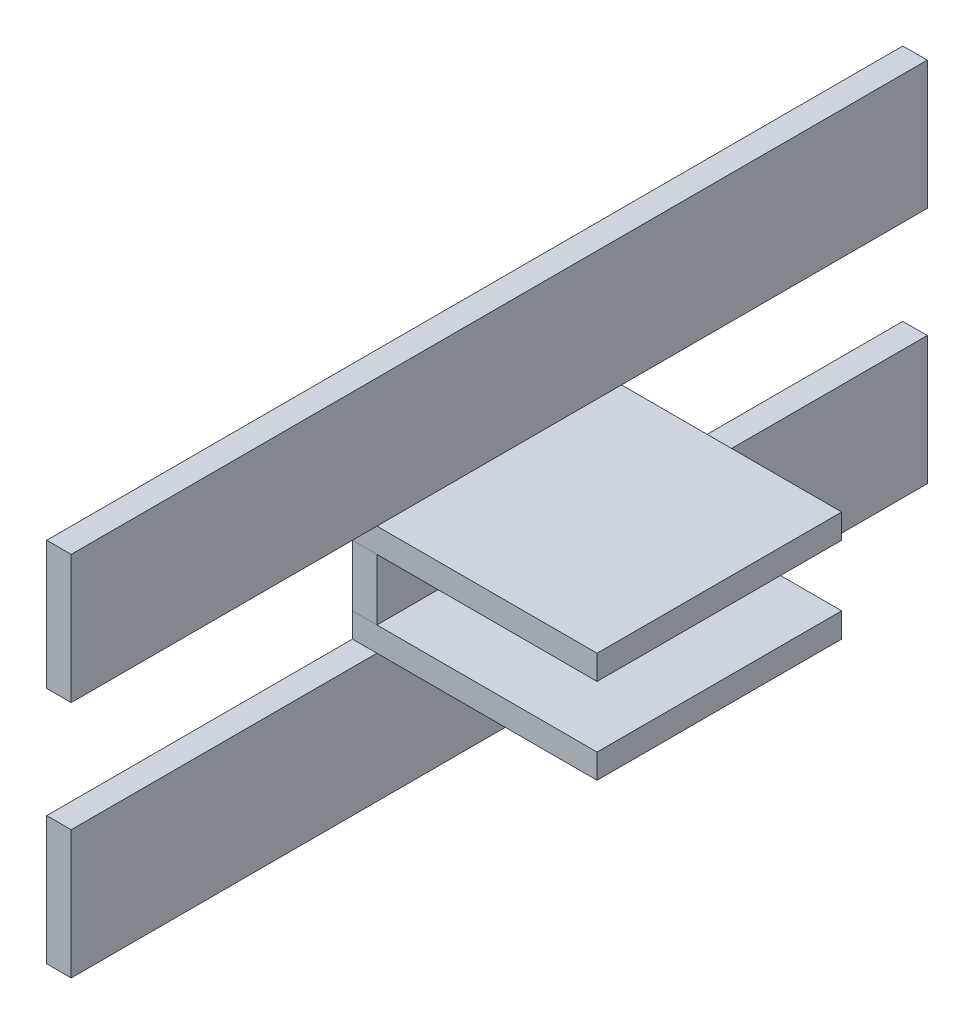
ISO-10303-21;
HEADER;
FILE_DESCRIPTION(('STEP AP214'),'2;1');
FILE_NAME('part.step','',(''),(''),'','','');
FILE_SCHEMA(('AUTOMOTIVE_DESIGN { 1 0 10303 214 1 1 1 1 }'));
ENDSEC;
DATA;
#1=APPLICATION_CONTEXT('core data for automotive mechanical design processes');
#2=APPLICATION_PROTOCOL_DEFINITION('international standard','automotive_design',2000,#1);
#3=PRODUCT_CONTEXT('',#1,'mechanical');
#4=PRODUCT('Part','Part','',(#3));
#5=PRODUCT_RELATED_PRODUCT_CATEGORY('part','',(#4));
#6=PRODUCT_DEFINITION_FORMATION('','',#4);
#7=PRODUCT_DEFINITION_CONTEXT('part definition',#1,'design');
#8=PRODUCT_DEFINITION('design','',#6,#7);
#9=PRODUCT_DEFINITION_SHAPE('','',#8);
#10=(LENGTH_UNIT() NAMED_UNIT(*) SI_UNIT(.MILLI.,.METRE.));
#11=(NAMED_UNIT(*) PLANE_ANGLE_UNIT() SI_UNIT($,.RADIAN.));
#12=(NAMED_UNIT(*) SI_UNIT($,.STERADIAN.) SOLID_ANGLE_UNIT());
#13=UNCERTAINTY_MEASURE_WITH_UNIT(LENGTH_MEASURE(1.E-05),#10,'distance_accuracy_value','');
#14=(GEOMETRIC_REPRESENTATION_CONTEXT(3) GLOBAL_UNCERTAINTY_ASSIGNED_CONTEXT((#13)) GLOBAL_UNIT_ASSIGNED_CONTEXT((#10,
#11,#12)) REPRESENTATION_CONTEXT('',''));
#15=CARTESIAN_POINT('',(0.,0.,0.));
#16=DIRECTION('',(0.,0.,1.));
#17=DIRECTION('',(1.,0.,0.));
#18=AXIS2_PLACEMENT_3D('',#15,#16,#17);
#19=CARTESIAN_POINT('',(2.,0.,-45.));
#20=DIRECTION('',(0.,0.,-1.));
#21=DIRECTION('',(-1.,0.,0.));
#22=AXIS2_PLACEMENT_3D('',#19,#20,#21);
#23=PLANE('',#22);
#24=DIRECTION('',(0.,-1.,0.));
#25=VECTOR('',#24,1.);
#26=CARTESIAN_POINT('',(0.,0.,-45.));
#27=LINE('',#26,#25);
#28=CARTESIAN_POINT('',(0.,17.5,-45.));
#29=VERTEX_POINT('',#28);
#30=CARTESIAN_POINT('',(0.,12.5,-45.));
#31=VERTEX_POINT('',#30);
#32=EDGE_CURVE('E115',#29,#31,#27,.T.);
#33=ORIENTED_EDGE('',*,*,#32,.F.);
#34=DIRECTION('',(-1.,0.,0.));
#35=VECTOR('',#34,1.);
#36=CARTESIAN_POINT('',(2.,17.5,-45.));
#37=LINE('',#36,#35);
#38=CARTESIAN_POINT('',(2.,17.5,-45.));
#39=VERTEX_POINT('',#38);
#40=EDGE_CURVE('E12',#39,#29,#37,.T.);
#41=ORIENTED_EDGE('',*,*,#40,.F.);
#42=DIRECTION('',(0.,-1.,0.));
#43=VECTOR('',#42,1.);
#44=CARTESIAN_POINT('',(2.,0.,-45.));
#45=LINE('',#44,#43);
#46=CARTESIAN_POINT('',(2.,12.5,-45.));
#47=VERTEX_POINT('',#46);
#48=EDGE_CURVE('E108',#39,#47,#45,.T.);
#49=ORIENTED_EDGE('',*,*,#48,.T.);
#50=DIRECTION('',(-1.,0.,0.));
#51=VECTOR('',#50,1.);
#52=CARTESIAN_POINT('',(2.,12.5,-45.));
#53=LINE('',#52,#51);
#54=EDGE_CURVE('E90',#47,#31,#53,.T.);
#55=ORIENTED_EDGE('',*,*,#54,.T.);
#56=EDGE_LOOP('',(#33,#41,#49,#55));
#57=FACE_BOUND('',#56,.T.);
#58=ADVANCED_FACE('F52',(#57),#23,.T.);
#59=CARTESIAN_POINT('',(2.,17.5,0.));
#60=DIRECTION('',(0.,1.,0.));
#61=DIRECTION('',(0.,0.,1.));
#62=AXIS2_PLACEMENT_3D('',#59,#60,#61);
#63=PLANE('',#62);
#64=DIRECTION('',(0.,0.,-1.));
#65=VECTOR('',#64,1.);
#66=CARTESIAN_POINT('',(0.,17.5,0.));
#67=LINE('',#66,#65);
#68=CARTESIAN_POINT('',(0.,17.5,-25.));
#69=VERTEX_POINT('',#68);
#70=EDGE_CURVE('E101',#69,#29,#67,.T.);
#71=ORIENTED_EDGE('',*,*,#70,.F.);
#72=DIRECTION('',(-1.,0.,0.));
#73=VECTOR('',#72,1.);
#74=CARTESIAN_POINT('',(2.,17.5,-25.));
#75=LINE('',#74,#73);
#76=CARTESIAN_POINT('',(2.,17.5,-25.));
#77=VERTEX_POINT('',#76);
#78=EDGE_CURVE('E60',#77,#69,#75,.T.);
#79=ORIENTED_EDGE('',*,*,#78,.F.);
#80=DIRECTION('',(0.,0.,-1.));
#81=VECTOR('',#80,1.);
#82=CARTESIAN_POINT('',(2.,17.5,0.));
#83=LINE('',#82,#81);
#84=EDGE_CURVE('E99',#77,#39,#83,.T.);
#85=ORIENTED_EDGE('',*,*,#84,.T.);
#86=ORIENTED_EDGE('',*,*,#40,.T.);
#87=EDGE_LOOP('',(#71,#79,#85,#86));
#88=FACE_BOUND('',#87,.T.);
#89=ADVANCED_FACE('F98',(#88),#63,.T.);
#90=CARTESIAN_POINT('',(2.,0.,-25.));
#91=DIRECTION('',(0.,0.,1.));
#92=DIRECTION('',(1.,0.,0.));
#93=AXIS2_PLACEMENT_3D('',#90,#91,#92);
#94=PLANE('',#93);
#95=DIRECTION('',(0.,1.,0.));
#96=VECTOR('',#95,1.);
#97=CARTESIAN_POINT('',(0.,0.,-25.));
#98=LINE('',#97,#96);
#99=CARTESIAN_POINT('',(0.,12.5,-25.));
#100=VERTEX_POINT('',#99);
#101=EDGE_CURVE('E119',#100,#69,#98,.T.);
#102=ORIENTED_EDGE('',*,*,#101,.F.);
#103=DIRECTION('',(-1.,0.,0.));
#104=VECTOR('',#103,1.);
#105=CARTESIAN_POINT('',(2.,12.5,-25.));
#106=LINE('',#105,#104);
#107=CARTESIAN_POINT('',(2.,12.5,-25.));
#108=VERTEX_POINT('',#107);
#109=EDGE_CURVE('E83',#108,#100,#106,.T.);
#110=ORIENTED_EDGE('',*,*,#109,.F.);
#111=DIRECTION('',(0.,1.,0.));
#112=VECTOR('',#111,1.);
#113=CARTESIAN_POINT('',(2.,0.,-25.));
#114=LINE('',#113,#112);
#115=EDGE_CURVE('E107',#108,#77,#114,.T.);
#116=ORIENTED_EDGE('',*,*,#115,.T.);
#117=ORIENTED_EDGE('',*,*,#78,.T.);
#118=EDGE_LOOP('',(#102,#110,#116,#117));
#119=FACE_BOUND('',#118,.T.);
#120=ADVANCED_FACE('F110',(#119),#94,.T.);
#121=CARTESIAN_POINT('',(2.,12.5,0.));
#122=DIRECTION('',(0.,1.,0.));
#123=DIRECTION('',(0.,0.,1.));
#124=AXIS2_PLACEMENT_3D('',#121,#122,#123);
#125=PLANE('',#124);
#126=DIRECTION('',(0.,0.,-1.));
#127=VECTOR('',#126,1.);
#128=CARTESIAN_POINT('',(0.,12.5,0.));
#129=LINE('',#128,#127);
#130=EDGE_CURVE('E121',#100,#31,#129,.T.);
#131=ORIENTED_EDGE('',*,*,#130,.T.);
#132=ORIENTED_EDGE('',*,*,#54,.F.);
#133=DIRECTION('',(0.,0.,-1.));
#134=VECTOR('',#133,1.);
#135=CARTESIAN_POINT('',(2.,12.5,0.));
#136=LINE('',#135,#134);
#137=EDGE_CURVE('E68',#108,#47,#136,.T.);
#138=ORIENTED_EDGE('',*,*,#137,.F.);
#139=ORIENTED_EDGE('',*,*,#109,.T.);
#140=EDGE_LOOP('',(#131,#132,#138,#139));
#141=FACE_BOUND('',#140,.T.);
#142=ADVANCED_FACE('F131',(#141),#125,.F.);
#143=CARTESIAN_POINT('',(2.,0.,0.));
#144=DIRECTION('',(1.,0.,0.));
#145=DIRECTION('',(0.,0.,-1.));
#146=AXIS2_PLACEMENT_3D('',#143,#144,#145);
#147=PLANE('',#146);
#148=ORIENTED_EDGE('',*,*,#48,.F.);
#149=ORIENTED_EDGE('',*,*,#84,.F.);
#150=ORIENTED_EDGE('',*,*,#115,.F.);
#151=ORIENTED_EDGE('',*,*,#137,.T.);
#152=EDGE_LOOP('',(#148,#149,#150,#151));
#153=FACE_BOUND('',#152,.T.);
#154=ADVANCED_FACE('F106',(#153),#147,.T.);
#155=CARTESIAN_POINT('',(0.,0.,0.));
#156=DIRECTION('',(1.,0.,0.));
#157=DIRECTION('',(0.,0.,-1.));
#158=AXIS2_PLACEMENT_3D('',#155,#156,#157);
#159=PLANE('',#158);
#160=ORIENTED_EDGE('',*,*,#32,.T.);
#161=ORIENTED_EDGE('',*,*,#130,.F.);
#162=ORIENTED_EDGE('',*,*,#101,.T.);
#163=ORIENTED_EDGE('',*,*,#70,.T.);
#164=EDGE_LOOP('',(#160,#161,#162,#163));
#165=FACE_BOUND('',#164,.T.);
#166=ADVANCED_FACE('F136',(#165),#159,.F.);
#167=CLOSED_SHELL('',(#58,#89,#120,#142,#154,#166));
#168=MANIFOLD_SOLID_BREP('B2',#167);
#169=CARTESIAN_POINT('',(2.,10.5,0.));
#170=DIRECTION('',(0.,-1.,0.));
#171=DIRECTION('',(0.,0.,-1.));
#172=AXIS2_PLACEMENT_3D('',#169,#170,#171);
#173=PLANE('',#172);
#174=DIRECTION('',(-1.,0.,0.));
#175=VECTOR('',#174,1.);
#176=CARTESIAN_POINT('',(20.,10.5,-45.));
#177=LINE('',#176,#175);
#178=CARTESIAN_POINT('',(2.,10.5,-45.));
#179=VERTEX_POINT('',#178);
#180=CARTESIAN_POINT('',(0.,10.5,-45.));
#181=VERTEX_POINT('',#180);
#182=EDGE_CURVE('E50',#179,#181,#177,.T.);
#183=ORIENTED_EDGE('',*,*,#182,.F.);
#184=DIRECTION('',(0.,0.,1.));
#185=VECTOR('',#184,1.);
#186=CARTESIAN_POINT('',(2.,10.5,0.));
#187=LINE('',#186,#185);
#188=CARTESIAN_POINT('',(2.,10.5,-70.));
#189=VERTEX_POINT('',#188);
#190=EDGE_CURVE('E326',#189,#179,#187,.T.);
#191=ORIENTED_EDGE('',*,*,#190,.F.);
#192=DIRECTION('',(-1.,0.,0.));
#193=VECTOR('',#192,1.);
#194=CARTESIAN_POINT('',(2.,10.5,-70.));
#195=LINE('',#194,#193);
#196=CARTESIAN_POINT('',(0.,10.5,-70.));
#197=VERTEX_POINT('',#196);
#198=EDGE_CURVE('E195',#189,#197,#195,.T.);
#199=ORIENTED_EDGE('',*,*,#198,.T.);
#200=DIRECTION('',(0.,0.,1.));
#201=VECTOR('',#200,1.);
#202=CARTESIAN_POINT('',(0.,10.5,0.));
#203=LINE('',#202,#201);
#204=EDGE_CURVE('E340',#197,#181,#203,.T.);
#205=ORIENTED_EDGE('',*,*,#204,.T.);
#206=EDGE_LOOP('',(#183,#191,#199,#205));
#207=FACE_BOUND('',#206,.T.);
#208=ADVANCED_FACE('F191',(#207),#173,.F.);
#209=CARTESIAN_POINT('',(2.,0.,-70.));
#210=DIRECTION('',(0.,0.,-1.));
#211=DIRECTION('',(-1.,0.,0.));
#212=AXIS2_PLACEMENT_3D('',#209,#210,#211);
#213=PLANE('',#212);
#214=DIRECTION('',(0.,-1.,0.));
#215=VECTOR('',#214,1.);
#216=CARTESIAN_POINT('',(0.,0.,-70.));
#217=LINE('',#216,#215);
#218=CARTESIAN_POINT('',(0.,0.,-70.));
#219=VERTEX_POINT('',#218);
#220=EDGE_CURVE('E285',#197,#219,#217,.T.);
#221=ORIENTED_EDGE('',*,*,#220,.F.);
#222=ORIENTED_EDGE('',*,*,#198,.F.);
#223=DIRECTION('',(0.,-1.,0.));
#224=VECTOR('',#223,1.);
#225=CARTESIAN_POINT('',(2.,0.,-70.));
#226=LINE('',#225,#224);
#227=CARTESIAN_POINT('',(2.,0.,-70.));
#228=VERTEX_POINT('',#227);
#229=EDGE_CURVE('E321',#189,#228,#226,.T.);
#230=ORIENTED_EDGE('',*,*,#229,.T.);
#231=DIRECTION('',(-1.,0.,0.));
#232=VECTOR('',#231,1.);
#233=CARTESIAN_POINT('',(2.,0.,-70.));
#234=LINE('',#233,#232);
#235=EDGE_CURVE('E240',#228,#219,#234,.T.);
#236=ORIENTED_EDGE('',*,*,#235,.T.);
#237=EDGE_LOOP('',(#221,#222,#230,#236));
#238=FACE_BOUND('',#237,.T.);
#239=ADVANCED_FACE('F193',(#238),#213,.T.);
#240=CARTESIAN_POINT('',(2.,10.5,-25.));
#241=VERTEX_POINT('',#240);
#242=CARTESIAN_POINT('',(2.,10.5,0.));
#243=VERTEX_POINT('',#242);
#244=EDGE_CURVE('E324',#241,#243,#187,.T.);
#245=ORIENTED_EDGE('',*,*,#244,.F.);
#246=DIRECTION('',(-1.,0.,0.));
#247=VECTOR('',#246,1.);
#248=CARTESIAN_POINT('',(20.,10.5,-25.));
#249=LINE('',#248,#247);
#250=CARTESIAN_POINT('',(0.,10.5,-25.));
#251=VERTEX_POINT('',#250);
#252=EDGE_CURVE('E201',#241,#251,#249,.T.);
#253=ORIENTED_EDGE('',*,*,#252,.T.);
#254=CARTESIAN_POINT('',(0.,10.5,0.));
#255=VERTEX_POINT('',#254);
#256=EDGE_CURVE('E339',#251,#255,#203,.T.);
#257=ORIENTED_EDGE('',*,*,#256,.T.);
#258=DIRECTION('',(-1.,0.,0.));
#259=VECTOR('',#258,1.);
#260=CARTESIAN_POINT('',(2.,10.5,0.));
#261=LINE('',#260,#259);
#262=EDGE_CURVE('E354',#243,#255,#261,.T.);
#263=ORIENTED_EDGE('',*,*,#262,.F.);
#264=EDGE_LOOP('',(#245,#253,#257,#263));
#265=FACE_BOUND('',#264,.T.);
#266=ADVANCED_FACE('F368',(#265),#173,.F.);
#267=CARTESIAN_POINT('',(2.,0.,0.));
#268=DIRECTION('',(0.,0.,-1.));
#269=DIRECTION('',(-1.,0.,0.));
#270=AXIS2_PLACEMENT_3D('',#267,#268,#269);
#271=PLANE('',#270);
#272=DIRECTION('',(0.,-1.,0.));
#273=VECTOR('',#272,1.);
#274=CARTESIAN_POINT('',(0.,0.,0.));
#275=LINE('',#274,#273);
#276=CARTESIAN_POINT('',(0.,0.,0.));
#277=VERTEX_POINT('',#276);
#278=EDGE_CURVE('E344',#255,#277,#275,.T.);
#279=ORIENTED_EDGE('',*,*,#278,.T.);
#280=DIRECTION('',(-1.,0.,0.));
#281=VECTOR('',#280,1.);
#282=CARTESIAN_POINT('',(2.,0.,0.));
#283=LINE('',#282,#281);
#284=CARTESIAN_POINT('',(2.,0.,0.));
#285=VERTEX_POINT('',#284);
#286=EDGE_CURVE('E351',#285,#277,#283,.T.);
#287=ORIENTED_EDGE('',*,*,#286,.F.);
#288=DIRECTION('',(0.,-1.,0.));
#289=VECTOR('',#288,1.);
#290=CARTESIAN_POINT('',(2.,0.,0.));
#291=LINE('',#290,#289);
#292=EDGE_CURVE('E330',#243,#285,#291,.T.);
#293=ORIENTED_EDGE('',*,*,#292,.F.);
#294=ORIENTED_EDGE('',*,*,#262,.T.);
#295=EDGE_LOOP('',(#279,#287,#293,#294));
#296=FACE_BOUND('',#295,.T.);
#297=ADVANCED_FACE('F385',(#296),#271,.F.);
#298=CARTESIAN_POINT('',(2.,0.,0.));
#299=DIRECTION('',(0.,1.,0.));
#300=DIRECTION('',(0.,0.,1.));
#301=AXIS2_PLACEMENT_3D('',#298,#299,#300);
#302=PLANE('',#301);
#303=DIRECTION('',(0.,0.,-1.));
#304=VECTOR('',#303,1.);
#305=CARTESIAN_POINT('',(0.,0.,0.));
#306=LINE('',#305,#304);
#307=EDGE_CURVE('E325',#277,#219,#306,.T.);
#308=ORIENTED_EDGE('',*,*,#307,.T.);
#309=ORIENTED_EDGE('',*,*,#235,.F.);
#310=DIRECTION('',(0.,0.,-1.));
#311=VECTOR('',#310,1.);
#312=CARTESIAN_POINT('',(2.,0.,0.));
#313=LINE('',#312,#311);
#314=EDGE_CURVE('E219',#285,#228,#313,.T.);
#315=ORIENTED_EDGE('',*,*,#314,.F.);
#316=ORIENTED_EDGE('',*,*,#286,.T.);
#317=EDGE_LOOP('',(#308,#309,#315,#316));
#318=FACE_BOUND('',#317,.T.);
#319=ADVANCED_FACE('F391',(#318),#302,.F.);
#320=CARTESIAN_POINT('',(2.,0.,0.));
#321=DIRECTION('',(1.,0.,0.));
#322=DIRECTION('',(0.,0.,-1.));
#323=AXIS2_PLACEMENT_3D('',#320,#321,#322);
#324=PLANE('',#323);
#325=ORIENTED_EDGE('',*,*,#229,.F.);
#326=ORIENTED_EDGE('',*,*,#190,.T.);
#327=EDGE_CURVE('E331',#179,#241,#187,.T.);
#328=ORIENTED_EDGE('',*,*,#327,.T.);
#329=ORIENTED_EDGE('',*,*,#244,.T.);
#330=ORIENTED_EDGE('',*,*,#292,.T.);
#331=ORIENTED_EDGE('',*,*,#314,.T.);
#332=EDGE_LOOP('',(#325,#326,#328,#329,#330,#331));
#333=FACE_BOUND('',#332,.T.);
#334=ADVANCED_FACE('F376',(#333),#324,.T.);
#335=CARTESIAN_POINT('',(0.,0.,0.));
#336=DIRECTION('',(1.,0.,0.));
#337=DIRECTION('',(0.,0.,-1.));
#338=AXIS2_PLACEMENT_3D('',#335,#336,#337);
#339=PLANE('',#338);
#340=ORIENTED_EDGE('',*,*,#220,.T.);
#341=ORIENTED_EDGE('',*,*,#307,.F.);
#342=ORIENTED_EDGE('',*,*,#278,.F.);
#343=ORIENTED_EDGE('',*,*,#256,.F.);
#344=DIRECTION('',(0.,1.,0.));
#345=VECTOR('',#344,1.);
#346=CARTESIAN_POINT('',(0.,0.,-25.));
#347=LINE('',#346,#345);
#348=CARTESIAN_POINT('',(0.,12.5,-25.));
#349=VERTEX_POINT('',#348);
#350=EDGE_CURVE('E210',#251,#349,#347,.T.);
#351=ORIENTED_EDGE('',*,*,#350,.T.);
#352=DIRECTION('',(0.,0.,-1.));
#353=VECTOR('',#352,1.);
#354=CARTESIAN_POINT('',(0.,12.5,0.));
#355=LINE('',#354,#353);
#356=CARTESIAN_POINT('',(0.,12.5,-45.));
#357=VERTEX_POINT('',#356);
#358=EDGE_CURVE('E309',#349,#357,#355,.T.);
#359=ORIENTED_EDGE('',*,*,#358,.T.);
#360=DIRECTION('',(0.,-1.,0.));
#361=VECTOR('',#360,1.);
#362=CARTESIAN_POINT('',(0.,0.,-45.));
#363=LINE('',#362,#361);
#364=EDGE_CURVE('E279',#357,#181,#363,.T.);
#365=ORIENTED_EDGE('',*,*,#364,.T.);
#366=ORIENTED_EDGE('',*,*,#204,.F.);
#367=EDGE_LOOP('',(#340,#341,#342,#343,#351,#359,#365,#366));
#368=FACE_BOUND('',#367,.T.);
#369=ADVANCED_FACE('F371',(#368),#339,.F.);
#370=CARTESIAN_POINT('',(20.,10.5,0.));
#371=DIRECTION('',(0.,-1.,0.));
#372=DIRECTION('',(0.,0.,-1.));
#373=AXIS2_PLACEMENT_3D('',#370,#371,#372);
#374=PLANE('',#373);
#375=ORIENTED_EDGE('',*,*,#327,.F.);
#376=CARTESIAN_POINT('',(20.,10.5,-45.));
#377=VERTEX_POINT('',#376);
#378=EDGE_CURVE('E203',#377,#179,#177,.T.);
#379=ORIENTED_EDGE('',*,*,#378,.F.);
#380=DIRECTION('',(0.,0.,1.));
#381=VECTOR('',#380,1.);
#382=CARTESIAN_POINT('',(20.,10.5,0.));
#383=LINE('',#382,#381);
#384=CARTESIAN_POINT('',(20.,10.5,-25.));
#385=VERTEX_POINT('',#384);
#386=EDGE_CURVE('E295',#377,#385,#383,.T.);
#387=ORIENTED_EDGE('',*,*,#386,.T.);
#388=EDGE_CURVE('E315',#385,#241,#249,.T.);
#389=ORIENTED_EDGE('',*,*,#388,.T.);
#390=EDGE_LOOP('',(#375,#379,#387,#389));
#391=FACE_BOUND('',#390,.T.);
#392=ADVANCED_FACE('F378',(#391),#374,.T.);
#393=CARTESIAN_POINT('',(20.,0.,-45.));
#394=DIRECTION('',(0.,0.,-1.));
#395=DIRECTION('',(-1.,0.,0.));
#396=AXIS2_PLACEMENT_3D('',#393,#394,#395);
#397=PLANE('',#396);
#398=ORIENTED_EDGE('',*,*,#364,.F.);
#399=DIRECTION('',(-1.,0.,0.));
#400=VECTOR('',#399,1.);
#401=CARTESIAN_POINT('',(20.,12.5,-45.));
#402=LINE('',#401,#400);
#403=CARTESIAN_POINT('',(20.,12.5,-45.));
#404=VERTEX_POINT('',#403);
#405=EDGE_CURVE('E272',#404,#357,#402,.T.);
#406=ORIENTED_EDGE('',*,*,#405,.F.);
#407=DIRECTION('',(0.,-1.,0.));
#408=VECTOR('',#407,1.);
#409=CARTESIAN_POINT('',(20.,0.,-45.));
#410=LINE('',#409,#408);
#411=EDGE_CURVE('E276',#404,#377,#410,.T.);
#412=ORIENTED_EDGE('',*,*,#411,.T.);
#413=ORIENTED_EDGE('',*,*,#378,.T.);
#414=ORIENTED_EDGE('',*,*,#182,.T.);
#415=EDGE_LOOP('',(#398,#406,#412,#413,#414));
#416=FACE_BOUND('',#415,.T.);
#417=ADVANCED_FACE('F274',(#416),#397,.T.);
#418=CARTESIAN_POINT('',(20.,12.5,0.));
#419=DIRECTION('',(0.,1.,0.));
#420=DIRECTION('',(0.,0.,1.));
#421=AXIS2_PLACEMENT_3D('',#418,#419,#420);
#422=PLANE('',#421);
#423=ORIENTED_EDGE('',*,*,#358,.F.);
#424=DIRECTION('',(-1.,0.,0.));
#425=VECTOR('',#424,1.);
#426=CARTESIAN_POINT('',(20.,12.5,-25.));
#427=LINE('',#426,#425);
#428=CARTESIAN_POINT('',(20.,12.5,-25.));
#429=VERTEX_POINT('',#428);
#430=EDGE_CURVE('E286',#429,#349,#427,.T.);
#431=ORIENTED_EDGE('',*,*,#430,.F.);
#432=DIRECTION('',(0.,0.,-1.));
#433=VECTOR('',#432,1.);
#434=CARTESIAN_POINT('',(20.,12.5,0.));
#435=LINE('',#434,#433);
#436=EDGE_CURVE('E292',#429,#404,#435,.T.);
#437=ORIENTED_EDGE('',*,*,#436,.T.);
#438=ORIENTED_EDGE('',*,*,#405,.T.);
#439=EDGE_LOOP('',(#423,#431,#437,#438));
#440=FACE_BOUND('',#439,.T.);
#441=ADVANCED_FACE('F298',(#440),#422,.T.);
#442=CARTESIAN_POINT('',(20.,0.,-25.));
#443=DIRECTION('',(0.,0.,1.));
#444=DIRECTION('',(1.,0.,0.));
#445=AXIS2_PLACEMENT_3D('',#442,#443,#444);
#446=PLANE('',#445);
#447=ORIENTED_EDGE('',*,*,#350,.F.);
#448=ORIENTED_EDGE('',*,*,#252,.F.);
#449=ORIENTED_EDGE('',*,*,#388,.F.);
#450=DIRECTION('',(0.,1.,0.));
#451=VECTOR('',#450,1.);
#452=CARTESIAN_POINT('',(20.,0.,-25.));
#453=LINE('',#452,#451);
#454=EDGE_CURVE('E300',#385,#429,#453,.T.);
#455=ORIENTED_EDGE('',*,*,#454,.T.);
#456=ORIENTED_EDGE('',*,*,#430,.T.);
#457=EDGE_LOOP('',(#447,#448,#449,#455,#456));
#458=FACE_BOUND('',#457,.T.);
#459=ADVANCED_FACE('F403',(#458),#446,.T.);
#460=CARTESIAN_POINT('',(20.,0.,0.));
#461=DIRECTION('',(1.,0.,0.));
#462=DIRECTION('',(0.,0.,-1.));
#463=AXIS2_PLACEMENT_3D('',#460,#461,#462);
#464=PLANE('',#463);
#465=ORIENTED_EDGE('',*,*,#411,.F.);
#466=ORIENTED_EDGE('',*,*,#436,.F.);
#467=ORIENTED_EDGE('',*,*,#454,.F.);
#468=ORIENTED_EDGE('',*,*,#386,.F.);
#469=EDGE_LOOP('',(#465,#466,#467,#468));
#470=FACE_BOUND('',#469,.T.);
#471=ADVANCED_FACE('F290',(#470),#464,.T.);
#472=CLOSED_SHELL('',(#208,#239,#266,#297,#319,#334,#369,#392,#417,#441,#459,#471));
#473=MANIFOLD_SOLID_BREP('B6',#472);
#474=CARTESIAN_POINT('',(2.,19.5,0.));
#475=DIRECTION('',(0.,1.,0.));
#476=DIRECTION('',(0.,0.,1.));
#477=AXIS2_PLACEMENT_3D('',#474,#475,#476);
#478=PLANE('',#477);
#479=DIRECTION('',(-1.,0.,0.));
#480=VECTOR('',#479,1.);
#481=CARTESIAN_POINT('',(20.,19.5,-25.));
#482=LINE('',#481,#480);
#483=CARTESIAN_POINT('',(2.,19.5,-25.));
#484=VERTEX_POINT('',#483);
#485=CARTESIAN_POINT('',(0.,19.5,-25.));
#486=VERTEX_POINT('',#485);
#487=EDGE_CURVE('E189',#484,#486,#482,.T.);
#488=ORIENTED_EDGE('',*,*,#487,.F.);
#489=DIRECTION('',(0.,0.,-1.));
#490=VECTOR('',#489,1.);
#491=CARTESIAN_POINT('',(2.,19.5,0.));
#492=LINE('',#491,#490);
#493=CARTESIAN_POINT('',(2.,19.5,0.));
#494=VERTEX_POINT('',#493);
#495=EDGE_CURVE('E553',#494,#484,#492,.T.);
#496=ORIENTED_EDGE('',*,*,#495,.F.);
#497=DIRECTION('',(-1.,0.,0.));
#498=VECTOR('',#497,1.);
#499=CARTESIAN_POINT('',(2.,19.5,0.));
#500=LINE('',#499,#498);
#501=CARTESIAN_POINT('',(0.,19.5,0.));
#502=VERTEX_POINT('',#501);
#503=EDGE_CURVE('E503',#494,#502,#500,.T.);
#504=ORIENTED_EDGE('',*,*,#503,.T.);
#505=DIRECTION('',(0.,0.,-1.));
#506=VECTOR('',#505,1.);
#507=CARTESIAN_POINT('',(0.,19.5,0.));
#508=LINE('',#507,#506);
#509=EDGE_CURVE('E631',#502,#486,#508,.T.);
#510=ORIENTED_EDGE('',*,*,#509,.T.);
#511=EDGE_LOOP('',(#488,#496,#504,#510));
#512=FACE_BOUND('',#511,.T.);
#513=ADVANCED_FACE('F499',(#512),#478,.F.);
#514=CARTESIAN_POINT('',(2.,0.,0.));
#515=DIRECTION('',(0.,0.,-1.));
#516=DIRECTION('',(-1.,0.,0.));
#517=AXIS2_PLACEMENT_3D('',#514,#515,#516);
#518=PLANE('',#517);
#519=DIRECTION('',(0.,-1.,0.));
#520=VECTOR('',#519,1.);
#521=CARTESIAN_POINT('',(0.,0.,0.));
#522=LINE('',#521,#520);
#523=CARTESIAN_POINT('',(0.,30.,0.));
#524=VERTEX_POINT('',#523);
#525=EDGE_CURVE('E588',#524,#502,#522,.T.);
#526=ORIENTED_EDGE('',*,*,#525,.T.);
#527=ORIENTED_EDGE('',*,*,#503,.F.);
#528=DIRECTION('',(0.,-1.,0.));
#529=VECTOR('',#528,1.);
#530=CARTESIAN_POINT('',(2.,0.,0.));
#531=LINE('',#530,#529);
#532=CARTESIAN_POINT('',(2.,30.,0.));
#533=VERTEX_POINT('',#532);
#534=EDGE_CURVE('E618',#533,#494,#531,.T.);
#535=ORIENTED_EDGE('',*,*,#534,.F.);
#536=DIRECTION('',(-1.,0.,0.));
#537=VECTOR('',#536,1.);
#538=CARTESIAN_POINT('',(2.,30.,0.));
#539=LINE('',#538,#537);
#540=EDGE_CURVE('E526',#533,#524,#539,.T.);
#541=ORIENTED_EDGE('',*,*,#540,.T.);
#542=EDGE_LOOP('',(#526,#527,#535,#541));
#543=FACE_BOUND('',#542,.T.);
#544=ADVANCED_FACE('F501',(#543),#518,.F.);
#545=CARTESIAN_POINT('',(2.,19.5,-45.));
#546=VERTEX_POINT('',#545);
#547=CARTESIAN_POINT('',(2.,19.5,-70.));
#548=VERTEX_POINT('',#547);
#549=EDGE_CURVE('E620',#546,#548,#492,.T.);
#550=ORIENTED_EDGE('',*,*,#549,.F.);
#551=DIRECTION('',(-1.,0.,0.));
#552=VECTOR('',#551,1.);
#553=CARTESIAN_POINT('',(20.,19.5,-45.));
#554=LINE('',#553,#552);
#555=CARTESIAN_POINT('',(0.,19.5,-45.));
#556=VERTEX_POINT('',#555);
#557=EDGE_CURVE('E508',#546,#556,#554,.T.);
#558=ORIENTED_EDGE('',*,*,#557,.T.);
#559=CARTESIAN_POINT('',(0.,19.5,-70.));
#560=VERTEX_POINT('',#559);
#561=EDGE_CURVE('E630',#556,#560,#508,.T.);
#562=ORIENTED_EDGE('',*,*,#561,.T.);
#563=DIRECTION('',(-1.,0.,0.));
#564=VECTOR('',#563,1.);
#565=CARTESIAN_POINT('',(2.,19.5,-70.));
#566=LINE('',#565,#564);
#567=EDGE_CURVE('E641',#548,#560,#566,.T.);
#568=ORIENTED_EDGE('',*,*,#567,.F.);
#569=EDGE_LOOP('',(#550,#558,#562,#568));
#570=FACE_BOUND('',#569,.T.);
#571=ADVANCED_FACE('F649',(#570),#478,.F.);
#572=CARTESIAN_POINT('',(2.,0.,-70.));
#573=DIRECTION('',(0.,0.,-1.));
#574=DIRECTION('',(-1.,0.,0.));
#575=AXIS2_PLACEMENT_3D('',#572,#573,#574);
#576=PLANE('',#575);
#577=DIRECTION('',(0.,-1.,0.));
#578=VECTOR('',#577,1.);
#579=CARTESIAN_POINT('',(0.,0.,-70.));
#580=LINE('',#579,#578);
#581=CARTESIAN_POINT('',(0.,30.,-70.));
#582=VERTEX_POINT('',#581);
#583=EDGE_CURVE('E634',#582,#560,#580,.T.);
#584=ORIENTED_EDGE('',*,*,#583,.F.);
#585=DIRECTION('',(-1.,0.,0.));
#586=VECTOR('',#585,1.);
#587=CARTESIAN_POINT('',(2.,30.,-70.));
#588=LINE('',#587,#586);
#589=CARTESIAN_POINT('',(2.,30.,-70.));
#590=VERTEX_POINT('',#589);
#591=EDGE_CURVE('E640',#590,#582,#588,.T.);
#592=ORIENTED_EDGE('',*,*,#591,.F.);
#593=DIRECTION('',(0.,-1.,0.));
#594=VECTOR('',#593,1.);
#595=CARTESIAN_POINT('',(2.,0.,-70.));
#596=LINE('',#595,#594);
#597=EDGE_CURVE('E623',#590,#548,#596,.T.);
#598=ORIENTED_EDGE('',*,*,#597,.T.);
#599=ORIENTED_EDGE('',*,*,#567,.T.);
#600=EDGE_LOOP('',(#584,#592,#598,#599));
#601=FACE_BOUND('',#600,.T.);
#602=ADVANCED_FACE('F654',(#601),#576,.T.);
#603=CARTESIAN_POINT('',(2.,30.,0.));
#604=DIRECTION('',(0.,1.,0.));
#605=DIRECTION('',(0.,0.,1.));
#606=AXIS2_PLACEMENT_3D('',#603,#604,#605);
#607=PLANE('',#606);
#608=DIRECTION('',(0.,0.,-1.));
#609=VECTOR('',#608,1.);
#610=CARTESIAN_POINT('',(0.,30.,0.));
#611=LINE('',#610,#609);
#612=EDGE_CURVE('E621',#524,#582,#611,.T.);
#613=ORIENTED_EDGE('',*,*,#612,.F.);
#614=ORIENTED_EDGE('',*,*,#540,.F.);
#615=DIRECTION('',(0.,0.,-1.));
#616=VECTOR('',#615,1.);
#617=CARTESIAN_POINT('',(2.,30.,0.));
#618=LINE('',#617,#616);
#619=EDGE_CURVE('E627',#533,#590,#618,.T.);
#620=ORIENTED_EDGE('',*,*,#619,.T.);
#621=ORIENTED_EDGE('',*,*,#591,.T.);
#622=EDGE_LOOP('',(#613,#614,#620,#621));
#623=FACE_BOUND('',#622,.T.);
#624=ADVANCED_FACE('F659',(#623),#607,.T.);
#625=CARTESIAN_POINT('',(2.,0.,0.));
#626=DIRECTION('',(1.,0.,0.));
#627=DIRECTION('',(0.,0.,-1.));
#628=AXIS2_PLACEMENT_3D('',#625,#626,#627);
#629=PLANE('',#628);
#630=ORIENTED_EDGE('',*,*,#534,.T.);
#631=ORIENTED_EDGE('',*,*,#495,.T.);
#632=EDGE_CURVE('E624',#484,#546,#492,.T.);
#633=ORIENTED_EDGE('',*,*,#632,.T.);
#634=ORIENTED_EDGE('',*,*,#549,.T.);
#635=ORIENTED_EDGE('',*,*,#597,.F.);
#636=ORIENTED_EDGE('',*,*,#619,.F.);
#637=EDGE_LOOP('',(#630,#631,#633,#634,#635,#636));
#638=FACE_BOUND('',#637,.T.);
#639=ADVANCED_FACE('F658',(#638),#629,.T.);
#640=CARTESIAN_POINT('',(0.,0.,0.));
#641=DIRECTION('',(1.,0.,0.));
#642=DIRECTION('',(0.,0.,-1.));
#643=AXIS2_PLACEMENT_3D('',#640,#641,#642);
#644=PLANE('',#643);
#645=ORIENTED_EDGE('',*,*,#525,.F.);
#646=ORIENTED_EDGE('',*,*,#612,.T.);
#647=ORIENTED_EDGE('',*,*,#583,.T.);
#648=ORIENTED_EDGE('',*,*,#561,.F.);
#649=DIRECTION('',(0.,-1.,0.));
#650=VECTOR('',#649,1.);
#651=CARTESIAN_POINT('',(0.,0.,-45.));
#652=LINE('',#651,#650);
#653=CARTESIAN_POINT('',(0.,17.5,-45.));
#654=VERTEX_POINT('',#653);
#655=EDGE_CURVE('E517',#556,#654,#652,.T.);
#656=ORIENTED_EDGE('',*,*,#655,.T.);
#657=DIRECTION('',(0.,0.,-1.));
#658=VECTOR('',#657,1.);
#659=CARTESIAN_POINT('',(0.,17.5,0.));
#660=LINE('',#659,#658);
#661=CARTESIAN_POINT('',(0.,17.5,-25.));
#662=VERTEX_POINT('',#661);
#663=EDGE_CURVE('E599',#662,#654,#660,.T.);
#664=ORIENTED_EDGE('',*,*,#663,.F.);
#665=DIRECTION('',(0.,1.,0.));
#666=VECTOR('',#665,1.);
#667=CARTESIAN_POINT('',(0.,0.,-25.));
#668=LINE('',#667,#666);
#669=EDGE_CURVE('E610',#662,#486,#668,.T.);
#670=ORIENTED_EDGE('',*,*,#669,.T.);
#671=ORIENTED_EDGE('',*,*,#509,.F.);
#672=EDGE_LOOP('',(#645,#646,#647,#648,#656,#664,#670,#671));
#673=FACE_BOUND('',#672,.T.);
#674=ADVANCED_FACE('F652',(#673),#644,.F.);
#675=CARTESIAN_POINT('',(20.,19.5,0.));
#676=DIRECTION('',(0.,1.,0.));
#677=DIRECTION('',(0.,0.,1.));
#678=AXIS2_PLACEMENT_3D('',#675,#676,#677);
#679=PLANE('',#678);
#680=ORIENTED_EDGE('',*,*,#632,.F.);
#681=CARTESIAN_POINT('',(20.,19.5,-25.));
#682=VERTEX_POINT('',#681);
#683=EDGE_CURVE('E510',#682,#484,#482,.T.);
#684=ORIENTED_EDGE('',*,*,#683,.F.);
#685=DIRECTION('',(0.,0.,-1.));
#686=VECTOR('',#685,1.);
#687=CARTESIAN_POINT('',(20.,19.5,0.));
#688=LINE('',#687,#686);
#689=CARTESIAN_POINT('',(20.,19.5,-45.));
#690=VERTEX_POINT('',#689);
#691=EDGE_CURVE('E594',#682,#690,#688,.T.);
#692=ORIENTED_EDGE('',*,*,#691,.T.);
#693=EDGE_CURVE('E581',#690,#546,#554,.T.);
#694=ORIENTED_EDGE('',*,*,#693,.T.);
#695=EDGE_LOOP('',(#680,#684,#692,#694));
#696=FACE_BOUND('',#695,.T.);
#697=ADVANCED_FACE('F601',(#696),#679,.T.);
#698=CARTESIAN_POINT('',(20.,0.,-45.));
#699=DIRECTION('',(0.,0.,-1.));
#700=DIRECTION('',(-1.,0.,0.));
#701=AXIS2_PLACEMENT_3D('',#698,#699,#700);
#702=PLANE('',#701);
#703=ORIENTED_EDGE('',*,*,#655,.F.);
#704=ORIENTED_EDGE('',*,*,#557,.F.);
#705=ORIENTED_EDGE('',*,*,#693,.F.);
#706=DIRECTION('',(0.,-1.,0.));
#707=VECTOR('',#706,1.);
#708=CARTESIAN_POINT('',(20.,0.,-45.));
#709=LINE('',#708,#707);
#710=CARTESIAN_POINT('',(20.,17.5,-45.));
#711=VERTEX_POINT('',#710);
#712=EDGE_CURVE('E584',#690,#711,#709,.T.);
#713=ORIENTED_EDGE('',*,*,#712,.T.);
#714=DIRECTION('',(-1.,0.,0.));
#715=VECTOR('',#714,1.);
#716=CARTESIAN_POINT('',(20.,17.5,-45.));
#717=LINE('',#716,#715);
#718=EDGE_CURVE('E608',#711,#654,#717,.T.);
#719=ORIENTED_EDGE('',*,*,#718,.T.);
#720=EDGE_LOOP('',(#703,#704,#705,#713,#719));
#721=FACE_BOUND('',#720,.T.);
#722=ADVANCED_FACE('F583',(#721),#702,.T.);
#723=CARTESIAN_POINT('',(20.,0.,-25.));
#724=DIRECTION('',(0.,0.,1.));
#725=DIRECTION('',(1.,0.,0.));
#726=AXIS2_PLACEMENT_3D('',#723,#724,#725);
#727=PLANE('',#726);
#728=ORIENTED_EDGE('',*,*,#669,.F.);
#729=DIRECTION('',(-1.,0.,0.));
#730=VECTOR('',#729,1.);
#731=CARTESIAN_POINT('',(20.,17.5,-25.));
#732=LINE('',#731,#730);
#733=CARTESIAN_POINT('',(20.,17.5,-25.));
#734=VERTEX_POINT('',#733);
#735=EDGE_CURVE('E616',#734,#662,#732,.T.);
#736=ORIENTED_EDGE('',*,*,#735,.F.);
#737=DIRECTION('',(0.,1.,0.));
#738=VECTOR('',#737,1.);
#739=CARTESIAN_POINT('',(20.,0.,-25.));
#740=LINE('',#739,#738);
#741=EDGE_CURVE('E603',#734,#682,#740,.T.);
#742=ORIENTED_EDGE('',*,*,#741,.T.);
#743=ORIENTED_EDGE('',*,*,#683,.T.);
#744=ORIENTED_EDGE('',*,*,#487,.T.);
#745=EDGE_LOOP('',(#728,#736,#742,#743,#744));
#746=FACE_BOUND('',#745,.T.);
#747=ADVANCED_FACE('F724',(#746),#727,.T.);
#748=CARTESIAN_POINT('',(20.,17.5,0.));
#749=DIRECTION('',(0.,1.,0.));
#750=DIRECTION('',(0.,0.,1.));
#751=AXIS2_PLACEMENT_3D('',#748,#749,#750);
#752=PLANE('',#751);
#753=ORIENTED_EDGE('',*,*,#663,.T.);
#754=ORIENTED_EDGE('',*,*,#718,.F.);
#755=DIRECTION('',(0.,0.,-1.));
#756=VECTOR('',#755,1.);
#757=CARTESIAN_POINT('',(20.,17.5,0.));
#758=LINE('',#757,#756);
#759=EDGE_CURVE('E597',#734,#711,#758,.T.);
#760=ORIENTED_EDGE('',*,*,#759,.F.);
#761=ORIENTED_EDGE('',*,*,#735,.T.);
#762=EDGE_LOOP('',(#753,#754,#760,#761));
#763=FACE_BOUND('',#762,.T.);
#764=ADVANCED_FACE('F732',(#763),#752,.F.);
#765=CARTESIAN_POINT('',(20.,0.,0.));
#766=DIRECTION('',(1.,0.,0.));
#767=DIRECTION('',(0.,0.,-1.));
#768=AXIS2_PLACEMENT_3D('',#765,#766,#767);
#769=PLANE('',#768);
#770=ORIENTED_EDGE('',*,*,#712,.F.);
#771=ORIENTED_EDGE('',*,*,#691,.F.);
#772=ORIENTED_EDGE('',*,*,#741,.F.);
#773=ORIENTED_EDGE('',*,*,#759,.T.);
#774=EDGE_LOOP('',(#770,#771,#772,#773));
#775=FACE_BOUND('',#774,.T.);
#776=ADVANCED_FACE('F592',(#775),#769,.T.);
#777=CLOSED_SHELL('',(#513,#544,#571,#602,#624,#639,#674,#697,#722,#747,#764,#776));
#778=MANIFOLD_SOLID_BREP('B44',#777);
#779=ADVANCED_BREP_SHAPE_REPRESENTATION('',(#18,#168,#473,#778),#14);
#780=SHAPE_DEFINITION_REPRESENTATION(#9,#779);
ENDSEC;
END-ISO-10303-21;
